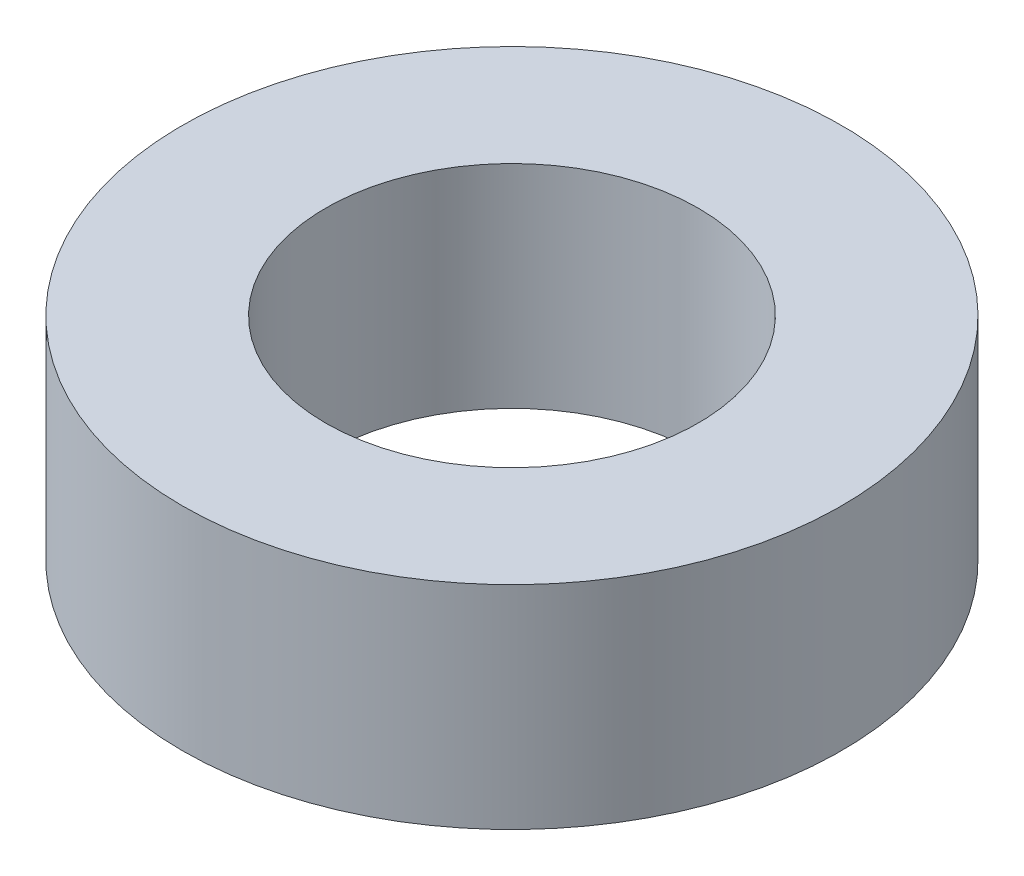
ISO-10303-21;
HEADER;
FILE_DESCRIPTION(('STEP AP214'),'2;1');
FILE_NAME('part.step','',(''),(''),'','','');
FILE_SCHEMA(('AUTOMOTIVE_DESIGN { 1 0 10303 214 1 1 1 1 }'));
ENDSEC;
DATA;
#1=APPLICATION_CONTEXT('core data for automotive mechanical design processes');
#2=APPLICATION_PROTOCOL_DEFINITION('international standard','automotive_design',2000,#1);
#3=PRODUCT_CONTEXT('',#1,'mechanical');
#4=PRODUCT('Part','Part','',(#3));
#5=PRODUCT_RELATED_PRODUCT_CATEGORY('part','',(#4));
#6=PRODUCT_DEFINITION_FORMATION('','',#4);
#7=PRODUCT_DEFINITION_CONTEXT('part definition',#1,'design');
#8=PRODUCT_DEFINITION('design','',#6,#7);
#9=PRODUCT_DEFINITION_SHAPE('','',#8);
#10=(LENGTH_UNIT() NAMED_UNIT(*) SI_UNIT(.MILLI.,.METRE.));
#11=(NAMED_UNIT(*) PLANE_ANGLE_UNIT() SI_UNIT($,.RADIAN.));
#12=(NAMED_UNIT(*) SI_UNIT($,.STERADIAN.) SOLID_ANGLE_UNIT());
#13=UNCERTAINTY_MEASURE_WITH_UNIT(LENGTH_MEASURE(1.E-05),#10,'distance_accuracy_value','');
#14=(GEOMETRIC_REPRESENTATION_CONTEXT(3) GLOBAL_UNCERTAINTY_ASSIGNED_CONTEXT((#13)) GLOBAL_UNIT_ASSIGNED_CONTEXT((#10,
#11,#12)) REPRESENTATION_CONTEXT('',''));
#15=CARTESIAN_POINT('',(0.,0.,0.));
#16=DIRECTION('',(0.,0.,1.));
#17=DIRECTION('',(1.,0.,0.));
#18=AXIS2_PLACEMENT_3D('',#15,#16,#17);
#19=CARTESIAN_POINT('',(0.,5.92,0.));
#20=DIRECTION('',(0.,1.,0.));
#21=DIRECTION('',(0.,0.,1.));
#22=AXIS2_PLACEMENT_3D('',#19,#20,#21);
#23=PLANE('',#22);
#24=CARTESIAN_POINT('',(0.,5.92,0.));
#25=DIRECTION('',(0.,1.,0.));
#26=DIRECTION('',(0.,0.,1.));
#27=AXIS2_PLACEMENT_3D('',#24,#25,#26);
#28=CIRCLE('',#27,9.2);
#29=CARTESIAN_POINT('',(0.,5.92,9.2));
#30=VERTEX_POINT('',#29);
#31=EDGE_CURVE('E10',#30,#30,#28,.T.);
#32=ORIENTED_EDGE('',*,*,#31,.T.);
#33=EDGE_LOOP('',(#32));
#34=FACE_BOUND('',#33,.T.);
#35=CARTESIAN_POINT('',(0.,5.92,0.));
#36=DIRECTION('',(0.,1.,0.));
#37=DIRECTION('',(0.,0.,1.));
#38=AXIS2_PLACEMENT_3D('',#35,#36,#37);
#39=CIRCLE('',#38,5.2);
#40=CARTESIAN_POINT('',(0.,5.92,5.2));
#41=VERTEX_POINT('',#40);
#42=EDGE_CURVE('E49',#41,#41,#39,.T.);
#43=ORIENTED_EDGE('',*,*,#42,.F.);
#44=EDGE_LOOP('',(#43));
#45=FACE_BOUND('',#44,.T.);
#46=ADVANCED_FACE('F39',(#34,#45),#23,.T.);
#47=CARTESIAN_POINT('',(0.,0.,0.));
#48=DIRECTION('',(0.,1.,0.));
#49=DIRECTION('',(0.,0.,1.));
#50=AXIS2_PLACEMENT_3D('',#47,#48,#49);
#51=PLANE('',#50);
#52=CARTESIAN_POINT('',(0.,0.,0.));
#53=DIRECTION('',(0.,1.,0.));
#54=DIRECTION('',(0.,0.,1.));
#55=AXIS2_PLACEMENT_3D('',#52,#53,#54);
#56=CIRCLE('',#55,9.2);
#57=CARTESIAN_POINT('',(0.,0.,9.2));
#58=VERTEX_POINT('',#57);
#59=EDGE_CURVE('E43',#58,#58,#56,.T.);
#60=ORIENTED_EDGE('',*,*,#59,.F.);
#61=EDGE_LOOP('',(#60));
#62=FACE_BOUND('',#61,.T.);
#63=CARTESIAN_POINT('',(0.,0.,0.));
#64=DIRECTION('',(0.,1.,0.));
#65=DIRECTION('',(0.,0.,1.));
#66=AXIS2_PLACEMENT_3D('',#63,#64,#65);
#67=CIRCLE('',#66,5.2);
#68=CARTESIAN_POINT('',(0.,0.,5.2));
#69=VERTEX_POINT('',#68);
#70=EDGE_CURVE('E55',#69,#69,#67,.T.);
#71=ORIENTED_EDGE('',*,*,#70,.T.);
#72=EDGE_LOOP('',(#71));
#73=FACE_BOUND('',#72,.T.);
#74=ADVANCED_FACE('F62',(#62,#73),#51,.F.);
#75=CARTESIAN_POINT('',(0.,5.92,0.));
#76=DIRECTION('',(0.,-1.,0.));
#77=DIRECTION('',(0.,0.,-1.));
#78=AXIS2_PLACEMENT_3D('',#75,#76,#77);
#79=CYLINDRICAL_SURFACE('',#78,9.2);
#80=ORIENTED_EDGE('',*,*,#31,.F.);
#81=EDGE_LOOP('',(#80));
#82=FACE_BOUND('',#81,.T.);
#83=ORIENTED_EDGE('',*,*,#59,.T.);
#84=EDGE_LOOP('',(#83));
#85=FACE_BOUND('',#84,.T.);
#86=ADVANCED_FACE('F41',(#82,#85),#79,.T.);
#87=CARTESIAN_POINT('',(0.,5.92,0.));
#88=DIRECTION('',(0.,-1.,0.));
#89=DIRECTION('',(0.,0.,-1.));
#90=AXIS2_PLACEMENT_3D('',#87,#88,#89);
#91=CYLINDRICAL_SURFACE('',#90,5.2);
#92=ORIENTED_EDGE('',*,*,#42,.T.);
#93=EDGE_LOOP('',(#92));
#94=FACE_BOUND('',#93,.T.);
#95=ORIENTED_EDGE('',*,*,#70,.F.);
#96=EDGE_LOOP('',(#95));
#97=FACE_BOUND('',#96,.T.);
#98=ADVANCED_FACE('F59',(#94,#97),#91,.F.);
#99=CLOSED_SHELL('',(#46,#74,#86,#98));
#100=MANIFOLD_SOLID_BREP('B2',#99);
#101=ADVANCED_BREP_SHAPE_REPRESENTATION('',(#18,#100),#14);
#102=SHAPE_DEFINITION_REPRESENTATION(#9,#101);
ENDSEC;
END-ISO-10303-21;
